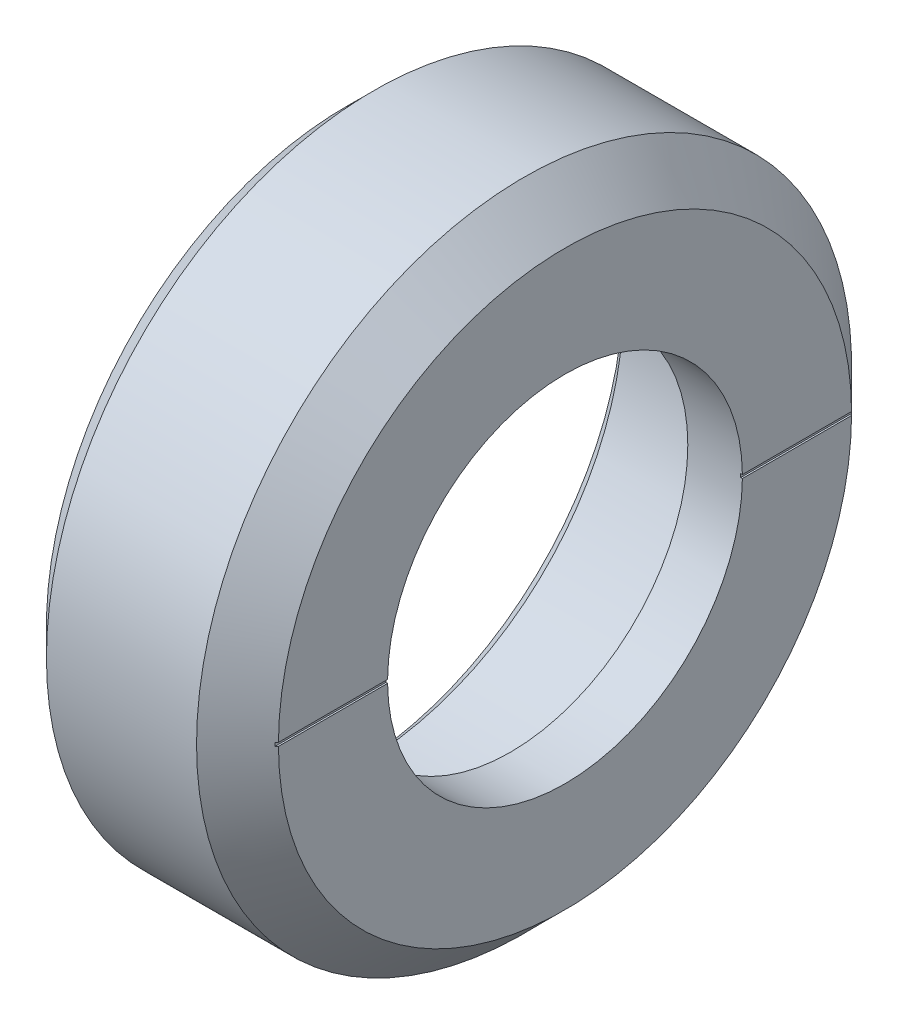
ISO-10303-21;
HEADER;
FILE_DESCRIPTION(('STEP AP214'),'2;1');
FILE_NAME('part.step','',(''),(''),'','','');
FILE_SCHEMA(('AUTOMOTIVE_DESIGN { 1 0 10303 214 1 1 1 1 }'));
ENDSEC;
DATA;
#1=APPLICATION_CONTEXT('core data for automotive mechanical design processes');
#2=APPLICATION_PROTOCOL_DEFINITION('international standard','automotive_design',2000,#1);
#3=PRODUCT_CONTEXT('',#1,'mechanical');
#4=PRODUCT('Part','Part','',(#3));
#5=PRODUCT_RELATED_PRODUCT_CATEGORY('part','',(#4));
#6=PRODUCT_DEFINITION_FORMATION('','',#4);
#7=PRODUCT_DEFINITION_CONTEXT('part definition',#1,'design');
#8=PRODUCT_DEFINITION('design','',#6,#7);
#9=PRODUCT_DEFINITION_SHAPE('','',#8);
#10=(LENGTH_UNIT() NAMED_UNIT(*) SI_UNIT(.MILLI.,.METRE.));
#11=(NAMED_UNIT(*) PLANE_ANGLE_UNIT() SI_UNIT($,.RADIAN.));
#12=(NAMED_UNIT(*) SI_UNIT($,.STERADIAN.) SOLID_ANGLE_UNIT());
#13=UNCERTAINTY_MEASURE_WITH_UNIT(LENGTH_MEASURE(1.E-05),#10,'distance_accuracy_value','');
#14=(GEOMETRIC_REPRESENTATION_CONTEXT(3) GLOBAL_UNCERTAINTY_ASSIGNED_CONTEXT((#13)) GLOBAL_UNIT_ASSIGNED_CONTEXT((#10,
#11,#12)) REPRESENTATION_CONTEXT('',''));
#15=CARTESIAN_POINT('',(0.,0.,0.));
#16=DIRECTION('',(0.,0.,1.));
#17=DIRECTION('',(1.,0.,0.));
#18=AXIS2_PLACEMENT_3D('',#15,#16,#17);
#19=CARTESIAN_POINT('',(16.,24.,0.));
#20=DIRECTION('',(-1.,0.,0.));
#21=DIRECTION('',(0.,0.,1.));
#22=AXIS2_PLACEMENT_3D('',#19,#20,#21);
#23=PLANE('',#22);
#24=DIRECTION('',(0.,0.,1.));
#25=VECTOR('',#24,1.);
#26=CARTESIAN_POINT('',(16.,0.125,0.));
#27=LINE('',#26,#25);
#28=CARTESIAN_POINT('',(16.,0.125,-20.9996279728951));
#29=VERTEX_POINT('',#28);
#30=CARTESIAN_POINT('',(16.,0.125,-12.9993990245703));
#31=VERTEX_POINT('',#30);
#32=EDGE_CURVE('E128',#29,#31,#27,.T.);
#33=ORIENTED_EDGE('',*,*,#32,.F.);
#34=CARTESIAN_POINT('',(16.,0.,0.));
#35=DIRECTION('',(-1.,0.,0.));
#36=DIRECTION('',(0.,0.,1.));
#37=AXIS2_PLACEMENT_3D('',#34,#35,#36);
#38=CIRCLE('',#37,21.);
#39=CARTESIAN_POINT('',(16.,0.125,20.9996279728951));
#40=VERTEX_POINT('',#39);
#41=EDGE_CURVE('E158',#29,#40,#38,.F.);
#42=ORIENTED_EDGE('',*,*,#41,.T.);
#43=CARTESIAN_POINT('',(16.,0.125,12.9993990245703));
#44=VERTEX_POINT('',#43);
#45=EDGE_CURVE('E133',#44,#40,#27,.T.);
#46=ORIENTED_EDGE('',*,*,#45,.F.);
#47=CARTESIAN_POINT('',(16.,0.,0.));
#48=DIRECTION('',(-1.,0.,0.));
#49=DIRECTION('',(0.,0.,1.));
#50=AXIS2_PLACEMENT_3D('',#47,#48,#49);
#51=CIRCLE('',#50,13.);
#52=EDGE_CURVE('E152',#44,#31,#51,.T.);
#53=ORIENTED_EDGE('',*,*,#52,.T.);
#54=EDGE_LOOP('',(#33,#42,#46,#53));
#55=FACE_BOUND('',#54,.T.);
#56=ADVANCED_FACE('F34',(#55),#23,.F.);
#57=DIRECTION('',(0.,0.,-1.));
#58=VECTOR('',#57,1.);
#59=CARTESIAN_POINT('',(16.,-0.125,0.));
#60=LINE('',#59,#58);
#61=CARTESIAN_POINT('',(16.,-0.125,20.9996279728951));
#62=VERTEX_POINT('',#61);
#63=CARTESIAN_POINT('',(16.,-0.125,12.9993990245703));
#64=VERTEX_POINT('',#63);
#65=EDGE_CURVE('E106',#62,#64,#60,.T.);
#66=ORIENTED_EDGE('',*,*,#65,.F.);
#67=CARTESIAN_POINT('',(16.,-0.125,-20.9996279728951));
#68=VERTEX_POINT('',#67);
#69=EDGE_CURVE('E159',#62,#68,#38,.F.);
#70=ORIENTED_EDGE('',*,*,#69,.T.);
#71=CARTESIAN_POINT('',(16.,-0.125,-12.9993990245703));
#72=VERTEX_POINT('',#71);
#73=EDGE_CURVE('E63',#72,#68,#60,.T.);
#74=ORIENTED_EDGE('',*,*,#73,.F.);
#75=EDGE_CURVE('E151',#72,#64,#51,.T.);
#76=ORIENTED_EDGE('',*,*,#75,.T.);
#77=EDGE_LOOP('',(#66,#70,#74,#76));
#78=FACE_BOUND('',#77,.T.);
#79=ADVANCED_FACE('F211',(#78),#23,.F.);
#80=CARTESIAN_POINT('',(0.,0.,0.));
#81=DIRECTION('',(-1.,0.,0.));
#82=DIRECTION('',(0.,0.,1.));
#83=AXIS2_PLACEMENT_3D('',#80,#81,#82);
#84=CYLINDRICAL_SURFACE('',#83,13.);
#85=CARTESIAN_POINT('',(12.,0.,0.));
#86=DIRECTION('',(-1.,0.,0.));
#87=DIRECTION('',(0.,0.,1.));
#88=AXIS2_PLACEMENT_3D('',#85,#86,#87);
#89=CIRCLE('',#88,13.);
#90=CARTESIAN_POINT('',(12.,0.,13.));
#91=VERTEX_POINT('',#90);
#92=EDGE_CURVE('E148',#91,#91,#89,.T.);
#93=ORIENTED_EDGE('',*,*,#92,.T.);
#94=EDGE_LOOP('',(#93));
#95=FACE_BOUND('',#94,.T.);
#96=DIRECTION('',(-1.,0.,0.));
#97=VECTOR('',#96,1.);
#98=CARTESIAN_POINT('',(0.,0.125,-12.9993990245703));
#99=LINE('',#98,#97);
#100=CARTESIAN_POINT('',(15.875,0.125,-12.9993990245703));
#101=VERTEX_POINT('',#100);
#102=EDGE_CURVE('E131',#31,#101,#99,.T.);
#103=ORIENTED_EDGE('',*,*,#102,.F.);
#104=ORIENTED_EDGE('',*,*,#52,.F.);
#105=DIRECTION('',(-1.,0.,0.));
#106=VECTOR('',#105,1.);
#107=CARTESIAN_POINT('',(0.,0.125,12.9993990245703));
#108=LINE('',#107,#106);
#109=CARTESIAN_POINT('',(15.875,0.125,12.9993990245703));
#110=VERTEX_POINT('',#109);
#111=EDGE_CURVE('E127',#110,#44,#108,.F.);
#112=ORIENTED_EDGE('',*,*,#111,.F.);
#113=CARTESIAN_POINT('',(15.875,0.,0.));
#114=DIRECTION('',(1.,0.,0.));
#115=DIRECTION('',(0.,0.,-1.));
#116=AXIS2_PLACEMENT_3D('',#113,#114,#115);
#117=CIRCLE('',#116,13.);
#118=CARTESIAN_POINT('',(15.875,-0.125,12.9993990245703));
#119=VERTEX_POINT('',#118);
#120=EDGE_CURVE('E115',#119,#110,#117,.F.);
#121=ORIENTED_EDGE('',*,*,#120,.F.);
#122=DIRECTION('',(-1.,0.,0.));
#123=VECTOR('',#122,1.);
#124=CARTESIAN_POINT('',(0.,-0.124999999999996,12.9993990245703));
#125=LINE('',#124,#123);
#126=EDGE_CURVE('E103',#64,#119,#125,.T.);
#127=ORIENTED_EDGE('',*,*,#126,.F.);
#128=ORIENTED_EDGE('',*,*,#75,.F.);
#129=DIRECTION('',(-1.,0.,0.));
#130=VECTOR('',#129,1.);
#131=CARTESIAN_POINT('',(0.,-0.124999999999996,-12.9993990245703));
#132=LINE('',#131,#130);
#133=CARTESIAN_POINT('',(15.875,-0.125,-12.9993990245703));
#134=VERTEX_POINT('',#133);
#135=EDGE_CURVE('E134',#134,#72,#132,.F.);
#136=ORIENTED_EDGE('',*,*,#135,.F.);
#137=EDGE_CURVE('E129',#101,#134,#117,.F.);
#138=ORIENTED_EDGE('',*,*,#137,.F.);
#139=EDGE_LOOP('',(#103,#104,#112,#121,#127,#128,#136,#138));
#140=FACE_BOUND('',#139,.T.);
#141=ADVANCED_FACE('F125',(#95,#140),#84,.F.);
#142=CARTESIAN_POINT('',(13.,0.,0.));
#143=DIRECTION('',(-1.,0.,0.));
#144=DIRECTION('',(0.,0.,1.));
#145=AXIS2_PLACEMENT_3D('',#142,#143,#144);
#146=CONICAL_SURFACE('',#145,24.,0.78539816339745);
#147=CARTESIAN_POINT('',(13.,0.,0.));
#148=DIRECTION('',(-1.,0.,0.));
#149=DIRECTION('',(0.,0.,1.));
#150=AXIS2_PLACEMENT_3D('',#147,#148,#149);
#151=CIRCLE('',#150,24.);
#152=CARTESIAN_POINT('',(13.,0.,24.));
#153=VERTEX_POINT('',#152);
#154=EDGE_CURVE('E155',#153,#153,#151,.T.);
#155=ORIENTED_EDGE('',*,*,#154,.F.);
#156=EDGE_LOOP('',(#155));
#157=FACE_BOUND('',#156,.T.);
#158=ORIENTED_EDGE('',*,*,#41,.F.);
#159=CARTESIAN_POINT('',(-12.9252976560844,0.125,49.9251411720451));
#160=CARTESIAN_POINT('',(-9.47868892144603,0.125,46.4785159888659));
#161=CARTESIAN_POINT('',(-6.0320768629025,0.125,43.0318941260126));
#162=CARTESIAN_POINT('',(0.86114243973046,0.125,36.138645580612));
#163=CARTESIAN_POINT('',(4.30774968381989,0.125,32.6920188980649));
#164=CARTESIAN_POINT('',(11.2009590986699,0.125,25.7987380494256));
#165=CARTESIAN_POINT('',(14.6475612693775,0.125,22.3520838832805));
#166=CARTESIAN_POINT('',(21.5407592292771,0.125,15.458769144818));
#167=CARTESIAN_POINT('',(24.9873550184691,0.125,12.0121085725006));
#168=CARTESIAN_POINT('',(29.378847397807,0.125,7.62013753107505));
#169=CARTESIAN_POINT('',(30.323887762627,0.125,6.67497078297029));
#170=CARTESIAN_POINT('',(31.9010751784641,0.125,5.09741305158182));
#171=CARTESIAN_POINT('',(32.5332486021043,0.125,4.46504845219102));
#172=CARTESIAN_POINT('',(33.5882224819469,0.125,3.40951556010458));
#173=CARTESIAN_POINT('',(34.0110626740735,0.125,2.98638695328445));
#174=CARTESIAN_POINT('',(34.7166075968785,0.125,2.28001451117343));
#175=CARTESIAN_POINT('',(34.9993696074962,0.125,1.99682797572084));
#176=CARTESIAN_POINT('',(35.4710250943881,0.125,1.52391912076779));
#177=CARTESIAN_POINT('',(35.6600089052332,0.125,1.3342868108399));
#178=CARTESIAN_POINT('',(35.9750435611063,0.125,1.0174128681121));
#179=CARTESIAN_POINT('',(36.1012198148177,0.125,0.890296376701036));
#180=CARTESIAN_POINT('',(36.2691038312773,0.125,0.720156826097159));
#181=CARTESIAN_POINT('',(36.3111466634024,0.125,0.677464652616413));
#182=CARTESIAN_POINT('',(36.3950680668786,0.125,0.591936908203082));
#183=CARTESIAN_POINT('',(36.4369466719064,0.125,0.549101370411308));
#184=CARTESIAN_POINT('',(36.5065958601945,0.125,0.477356265908579));
#185=CARTESIAN_POINT('',(36.5344501482026,0.125,0.448527963240153));
#186=CARTESIAN_POINT('',(36.5899259938108,0.125,0.390648502551401));
#187=CARTESIAN_POINT('',(36.6175475584739,0.125,0.361597351345891));
#188=CARTESIAN_POINT('',(36.6632939618919,0.125,0.31271820697438));
#189=CARTESIAN_POINT('',(36.6815457618244,0.125,0.293009068425436));
#190=CARTESIAN_POINT('',(36.7176568019819,0.125,0.253303619745465));
#191=CARTESIAN_POINT('',(36.735516771689,0.125,0.233307982810042));
#192=CARTESIAN_POINT('',(36.764563052184,0.125,0.199627211074484));
#193=CARTESIAN_POINT('',(36.7759490342116,0.125,0.18611433816584));
#194=CARTESIAN_POINT('',(36.7982590674934,0.125,0.158557602728288));
#195=CARTESIAN_POINT('',(36.8091797707082,0.125,0.144510939663878));
#196=CARTESIAN_POINT('',(36.8301456772942,0.125,0.115462636734964));
#197=CARTESIAN_POINT('',(36.8401752344993,0.125,0.100449807697324));
#198=CARTESIAN_POINT('',(36.8577745202263,0.125,0.0690623828583643));
#199=CARTESIAN_POINT('',(36.8653729376359,0.125,0.0527067692675883));
#200=CARTESIAN_POINT('',(36.8722910562418,0.125,0.0272919170357236));
#201=CARTESIAN_POINT('',(36.8738624122109,0.125,0.0188987000286322));
#202=CARTESIAN_POINT('',(36.8752665826695,0.125,0.00198824643673188));
#203=CARTESIAN_POINT('',(36.8751057701765,0.125,-0.00652842047201116));
#204=CARTESIAN_POINT('',(36.8731215101269,0.125,-0.0232960091732175));
#205=CARTESIAN_POINT('',(36.8713083550376,0.125,-0.0315482490818322));
#206=CARTESIAN_POINT('',(36.8664308400117,0.125,-0.0477028430076809));
#207=CARTESIAN_POINT('',(36.8633593029656,0.125,-0.0556028969197794));
#208=CARTESIAN_POINT('',(36.8533313284746,0.125,-0.0778265865200559));
#209=CARTESIAN_POINT('',(36.8453389795916,0.125,-0.0916645577396091));
#210=CARTESIAN_POINT('',(36.828048003347,0.125,-0.118516420333479));
#211=CARTESIAN_POINT('',(36.8187435007831,0.125,-0.131526200761651));
#212=CARTESIAN_POINT('',(36.7993638216938,0.125,-0.1571639692317));
#213=CARTESIAN_POINT('',(36.7892818428899,0.125,-0.169786809784387));
#214=CARTESIAN_POINT('',(36.7687529467012,0.125,-0.19467615551624));
#215=CARTESIAN_POINT('',(36.758306944989,0.125,-0.206943430094164));
#216=CARTESIAN_POINT('',(36.7270864735277,0.125,-0.242896234133044));
#217=CARTESIAN_POINT('',(36.7059799166911,0.125,-0.266292412717195));
#218=CARTESIAN_POINT('',(36.6633538104849,0.125,-0.312706678788425));
#219=CARTESIAN_POINT('',(36.6418341909564,0.125,-0.335724700791025));
#220=CARTESIAN_POINT('',(36.5768904209748,0.125,-0.404515871168181));
#221=CARTESIAN_POINT('',(36.5331306078186,0.125,-0.449971877773539));
#222=CARTESIAN_POINT('',(36.4456524942773,0.125,-0.540171619066018));
#223=CARTESIAN_POINT('',(36.4019370164949,0.125,-0.584918122662369));
#224=CARTESIAN_POINT('',(36.3143500958803,0.125,-0.674216016521059));
#225=CARTESIAN_POINT('',(36.2704787391651,0.125,-0.7187674910339));
#226=CARTESIAN_POINT('',(36.1386080897177,0.125,-0.852397541852838));
#227=CARTESIAN_POINT('',(36.0504662841755,0.125,-0.941335167394833));
#228=CARTESIAN_POINT('',(35.8740287356378,0.125,-1.11905822289925));
#229=CARTESIAN_POINT('',(35.7857329919675,0.125,-1.20784365219103));
#230=CARTESIAN_POINT('',(35.5206955409309,0.125,-1.47411687694933));
#231=CARTESIAN_POINT('',(35.3438368027602,0.125,-1.65148814789276));
#232=CARTESIAN_POINT('',(34.989440821709,0.125,-2.00670168785562));
#233=CARTESIAN_POINT('',(34.8119032392578,0.125,-2.18454361775702));
#234=CARTESIAN_POINT('',(34.4567827199271,0.125,-2.54016087596942));
#235=CARTESIAN_POINT('',(34.2791997864107,0.125,-2.71793620763822));
#236=CARTESIAN_POINT('',(33.391905111207,0.125,-3.6060667134762));
#237=CARTESIAN_POINT('',(32.6820054116647,0.125,-4.31623406635029));
#238=CARTESIAN_POINT('',(31.2621288550648,0.125,-5.73652354735152));
#239=CARTESIAN_POINT('',(30.5521519966307,0.125,-6.44664567410196));
#240=CARTESIAN_POINT('',(29.1331392361378,0.125,-7.86587985402368));
#241=CARTESIAN_POINT('',(28.4241033814295,0.125,-8.57499195452887));
#242=CARTESIAN_POINT('',(27.0060235433148,0.125,-9.99319821121912));
#243=CARTESIAN_POINT('',(26.2969795599986,0.125,-10.7022923674944));
#244=CARTESIAN_POINT('',(22.7504204515519,0.125,-14.2490689052053));
#245=CARTESIAN_POINT('',(19.9128549993168,0.125,-17.0867009638875));
#246=CARTESIAN_POINT('',(14.2377022466064,0.125,-22.761957580782));
#247=CARTESIAN_POINT('',(11.4001149460941,0.125,-25.5995821389573));
#248=CARTESIAN_POINT('',(5.72368698758439,0.125,-31.2760664860753));
#249=CARTESIAN_POINT('',(2.88484632560897,0.125,-34.1149262710402));
#250=CARTESIAN_POINT('',(-2.79283656425394,0.125,-39.7926411433705));
#251=CARTESIAN_POINT('',(-5.6316787921397,0.125,-42.6314962307375));
#252=CARTESIAN_POINT('',(-9.21302057997947,0.125,-46.2128515757804));
#253=CARTESIAN_POINT('',(-9.95551915568732,0.125,-46.9553528176758));
#254=CARTESIAN_POINT('',(-11.4404443572832,0.125,-48.4402831127381));
#255=CARTESIAN_POINT('',(-12.1828709831596,0.125,-49.1827121659166));
#256=CARTESIAN_POINT('',(-12.9252976560844,0.125,-49.9251411720451));
#257=B_SPLINE_CURVE_WITH_KNOTS('',3,(#159,#160,#161,#162,#163,#164,#165,#166,#167,#168,#169,
#170,#171,#172,#173,#174,#175,#176,#177,#178,#179,#180,#181,#182,#183,#184,#185,#186,#187,#188,
#189,#190,#191,#192,#193,#194,#195,#196,#197,#198,#199,#200,#201,#202,#203,#204,#205,#206,#207,
#208,#209,#210,#211,#212,#213,#214,#215,#216,#217,#218,#219,#220,#221,#222,#223,#224,#225,#226,
#227,#228,#229,#230,#231,#232,#233,#234,#235,#236,#237,#238,#239,#240,#241,#242,#243,#244,#245,
#246,#247,#248,#249,#250,#251,#252,#253,#254,#255,#256),.UNSPECIFIED.,.F.,.F.,(4,2,2,2,2,2,2,2,
2,2,2,2,2,2,2,2,2,2,2,2,2,2,2,2,2,2,2,2,2,2,2,2,2,2,2,2,2,2,2,2,2,2,2,2,2,2,2,2,4),(0.,
14.6227573478631,29.245514706896,43.8683196204714,58.4911245268065,62.5008593592025,
65.1833495645533,66.977920583549,68.1784787933916,68.9816462967298,69.518963448462,
69.6987187033743,69.8784349367054,69.9986943001206,70.1189500004921,70.199535507854,
70.2799554501239,70.3329628381186,70.386302943322,70.4404456544065,70.4939236242818,
70.5193874888522,70.5447576985253,70.5699709489846,70.5953300492626,70.6430748397891,
70.6910406291907,70.7394882104461,70.7878216592086,70.8823365686628,70.9768676760963,
71.1661496498323,71.3538190085838,71.5413971669988,71.9170427764593,72.2926900369119,
73.0441259460676,73.7980000248384,74.5518288390078,77.5642459676913,80.5767308610171,
83.5850769692085,86.5934022572772,98.6323141889064,110.671256559715,122.715478022308,
134.759692841819,137.909853165087,141.059707724319),.UNSPECIFIED.);
#258=CARTESIAN_POINT('',(15.875,0.125,-21.1246301742776));
#259=VERTEX_POINT('',#258);
#260=EDGE_CURVE('E11',#29,#259,#257,.T.);
#261=ORIENTED_EDGE('',*,*,#260,.T.);
#262=CARTESIAN_POINT('',(15.875,0.,0.));
#263=DIRECTION('',(1.,0.,0.));
#264=DIRECTION('',(0.,0.,-1.));
#265=AXIS2_PLACEMENT_3D('',#262,#263,#264);
#266=CIRCLE('',#265,21.125);
#267=CARTESIAN_POINT('',(15.875,-0.125,-21.1246301742776));
#268=VERTEX_POINT('',#267);
#269=EDGE_CURVE('E48',#259,#268,#266,.F.);
#270=ORIENTED_EDGE('',*,*,#269,.T.);
#271=CARTESIAN_POINT('',(-12.9252976560844,-0.124999999999994,-49.9251411720451));
#272=CARTESIAN_POINT('',(-9.47868892144603,-0.124999999999995,-46.4785159888659));
#273=CARTESIAN_POINT('',(-6.0320768629025,-0.124999999999995,-43.0318941260125));
#274=CARTESIAN_POINT('',(0.861142439730467,-0.124999999999997,-36.138645580612));
#275=CARTESIAN_POINT('',(4.3077496838199,-0.124999999999997,-32.6920188980649));
#276=CARTESIAN_POINT('',(11.2009590986699,-0.124999999999999,-25.7987380494256));
#277=CARTESIAN_POINT('',(14.6475612693775,-0.124999999999999,-22.3520838832805));
#278=CARTESIAN_POINT('',(21.5407592292771,-0.125000000000001,-15.458769144818));
#279=CARTESIAN_POINT('',(24.9873550184691,-0.125000000000002,-12.0121085725006));
#280=CARTESIAN_POINT('',(29.378847397807,-0.125000000000002,-7.62013753107506));
#281=CARTESIAN_POINT('',(30.323887762627,-0.125000000000003,-6.67497078297029));
#282=CARTESIAN_POINT('',(31.9010751784641,-0.125000000000003,-5.09741305158182));
#283=CARTESIAN_POINT('',(32.5332486021043,-0.125000000000003,-4.46504845219102));
#284=CARTESIAN_POINT('',(33.5882224819469,-0.125000000000003,-3.40951556010459));
#285=CARTESIAN_POINT('',(34.0110626740735,-0.125000000000003,-2.98638695328446));
#286=CARTESIAN_POINT('',(34.7166075968785,-0.125000000000004,-2.28001451117344));
#287=CARTESIAN_POINT('',(34.9993696074962,-0.125000000000004,-1.99682797572085));
#288=CARTESIAN_POINT('',(35.4710250943881,-0.125000000000004,-1.52391912076779));
#289=CARTESIAN_POINT('',(35.6600089052332,-0.125000000000004,-1.33428681083991));
#290=CARTESIAN_POINT('',(35.9750435611063,-0.125000000000004,-1.0174128681121));
#291=CARTESIAN_POINT('',(36.1012198148177,-0.125000000000004,-0.890296376701036));
#292=CARTESIAN_POINT('',(36.2691038312773,-0.125000000000004,-0.720156826097158));
#293=CARTESIAN_POINT('',(36.3111466634024,-0.125000000000004,-0.677464652616412));
#294=CARTESIAN_POINT('',(36.3950680668786,-0.125000000000004,-0.591936908203081));
#295=CARTESIAN_POINT('',(36.4369466719064,-0.125000000000004,-0.549101370411308));
#296=CARTESIAN_POINT('',(36.5065958601945,-0.125000000000004,-0.477356265908578));
#297=CARTESIAN_POINT('',(36.5344501482026,-0.125000000000004,-0.448527963240152));
#298=CARTESIAN_POINT('',(36.5899259938108,-0.125000000000004,-0.390648502551399));
#299=CARTESIAN_POINT('',(36.6175475584739,-0.125000000000004,-0.361597351345889));
#300=CARTESIAN_POINT('',(36.6632939618919,-0.125000000000004,-0.312718206974379));
#301=CARTESIAN_POINT('',(36.6815457618244,-0.125000000000004,-0.293009068425434));
#302=CARTESIAN_POINT('',(36.7176568019819,-0.125000000000004,-0.253303619745461));
#303=CARTESIAN_POINT('',(36.735516771689,-0.125000000000004,-0.233307982810037));
#304=CARTESIAN_POINT('',(36.764563052184,-0.125000000000004,-0.199627211074481));
#305=CARTESIAN_POINT('',(36.7759490342116,-0.125000000000004,-0.186114338165837));
#306=CARTESIAN_POINT('',(36.7982590674934,-0.125000000000004,-0.158557602728282));
#307=CARTESIAN_POINT('',(36.8091797707082,-0.125000000000004,-0.144510939663869));
#308=CARTESIAN_POINT('',(36.8301456772942,-0.125000000000004,-0.115462636734952));
#309=CARTESIAN_POINT('',(36.8401752344993,-0.125000000000004,-0.100449807697314));
#310=CARTESIAN_POINT('',(36.8577745202263,-0.125000000000004,-0.0690623828583508));
#311=CARTESIAN_POINT('',(36.8653729376359,-0.125000000000004,-0.0527067692675704));
#312=CARTESIAN_POINT('',(36.8722910562418,-0.125000000000004,-0.0272919170357001));
#313=CARTESIAN_POINT('',(36.873862412211,-0.125000000000004,-0.018898700028608));
#314=CARTESIAN_POINT('',(36.8752665826695,-0.125000000000004,-0.00198824643670701));
#315=CARTESIAN_POINT('',(36.8751057701765,-0.125000000000004,0.00652842047203608));
#316=CARTESIAN_POINT('',(36.8731215101269,-0.125000000000004,0.0232960091732427));
#317=CARTESIAN_POINT('',(36.8713083550376,-0.125000000000004,0.0315482490818577));
#318=CARTESIAN_POINT('',(36.8664308400117,-0.125000000000004,0.0477028430077052));
#319=CARTESIAN_POINT('',(36.8633593029656,-0.125000000000004,0.0556028969198021));
#320=CARTESIAN_POINT('',(36.8533313284746,-0.125000000000004,0.0778265865200856));
#321=CARTESIAN_POINT('',(36.8453389795915,-0.125000000000004,0.091664557739648));
#322=CARTESIAN_POINT('',(36.8280480033469,-0.125000000000004,0.118516420333533));
#323=CARTESIAN_POINT('',(36.818743500783,-0.125000000000004,0.131526200761711));
#324=CARTESIAN_POINT('',(36.7993638216938,-0.125000000000004,0.157163969231774));
#325=CARTESIAN_POINT('',(36.7892818428898,-0.125000000000004,0.169786809784468));
#326=CARTESIAN_POINT('',(36.7687529467011,-0.125000000000004,0.194676155516336));
#327=CARTESIAN_POINT('',(36.7583069449889,-0.125000000000004,0.206943430094268));
#328=CARTESIAN_POINT('',(36.7270864735276,-0.125000000000004,0.242896234133168));
#329=CARTESIAN_POINT('',(36.705979916691,-0.125000000000004,0.266292412717329));
#330=CARTESIAN_POINT('',(36.6633538104848,-0.125000000000004,0.31270667878858));
#331=CARTESIAN_POINT('',(36.6418341909562,-0.125000000000004,0.335724700791189));
#332=CARTESIAN_POINT('',(36.5768904209746,-0.125000000000004,0.404515871168388));
#333=CARTESIAN_POINT('',(36.5331306078184,-0.125000000000004,0.449971877773779));
#334=CARTESIAN_POINT('',(36.445652494277,-0.125000000000004,0.540171619066319));
#335=CARTESIAN_POINT('',(36.4019370164946,-0.125000000000004,0.584918122662698));
#336=CARTESIAN_POINT('',(36.3143500958799,-0.125000000000004,0.674216016521441));
#337=CARTESIAN_POINT('',(36.2704787391647,-0.125000000000004,0.718767491034309));
#338=CARTESIAN_POINT('',(36.1386080897173,-0.125000000000004,0.852397541853324));
#339=CARTESIAN_POINT('',(36.050466284175,-0.125000000000004,0.941335167395367));
#340=CARTESIAN_POINT('',(35.8740287356372,-0.125000000000004,1.11905822289989));
#341=CARTESIAN_POINT('',(35.7857329919669,-0.125000000000004,1.20784365219174));
#342=CARTESIAN_POINT('',(35.52069554093,-0.125000000000004,1.47411687695021));
#343=CARTESIAN_POINT('',(35.3438368027592,-0.125000000000004,1.65148814789374));
#344=CARTESIAN_POINT('',(34.9894408217078,-0.125000000000004,2.00670168785682));
#345=CARTESIAN_POINT('',(34.8119032392565,-0.125000000000004,2.18454361775833));
#346=CARTESIAN_POINT('',(34.4567827199255,-0.125000000000003,2.54016087597096));
#347=CARTESIAN_POINT('',(34.2791997864091,-0.125000000000003,2.71793620763986));
#348=CARTESIAN_POINT('',(33.3919051112048,-0.125000000000003,3.6060667134784));
#349=CARTESIAN_POINT('',(32.6820054116621,-0.125000000000003,4.31623406635293));
#350=CARTESIAN_POINT('',(31.2621288550612,-0.125000000000003,5.73652354735504));
#351=CARTESIAN_POINT('',(30.5521519966267,-0.125000000000003,6.44664567410593));
#352=CARTESIAN_POINT('',(29.133139236133,-0.125000000000002,7.86587985402854));
#353=CARTESIAN_POINT('',(28.4241033814242,-0.125000000000002,8.57499195453416));
#354=CARTESIAN_POINT('',(27.0060235433086,-0.125000000000002,9.9931982112253));
#355=CARTESIAN_POINT('',(26.2969795599919,-0.125000000000002,10.702292367501));
#356=CARTESIAN_POINT('',(22.7504204515431,-0.125000000000001,14.2490689052142));
#357=CARTESIAN_POINT('',(19.9128549993062,-0.125,17.0867009638981));
#358=CARTESIAN_POINT('',(14.2377022465922,-0.124999999999999,22.7619575807962));
#359=CARTESIAN_POINT('',(11.4001149460782,-0.124999999999999,25.5995821389732));
#360=CARTESIAN_POINT('',(5.72368698756493,-0.124999999999998,31.2760664860947));
#361=CARTESIAN_POINT('',(2.88484632558774,-0.124999999999997,34.1149262710615));
#362=CARTESIAN_POINT('',(-2.79283656427871,-0.124999999999996,39.7926411433953));
#363=CARTESIAN_POINT('',(-5.63167879216625,-0.124999999999995,42.6314962307641));
#364=CARTESIAN_POINT('',(-9.21302058000306,-0.124999999999995,46.212851575804));
#365=CARTESIAN_POINT('',(-9.95551915570619,-0.124999999999994,46.9553528176947));
#366=CARTESIAN_POINT('',(-11.4404443572926,-0.124999999999994,48.4402831127475));
#367=CARTESIAN_POINT('',(-12.1828709831644,-0.124999999999994,49.1827121659213));
#368=CARTESIAN_POINT('',(-12.9252976560844,-0.124999999999994,49.9251411720451));
#369=B_SPLINE_CURVE_WITH_KNOTS('',3,(#271,#272,#273,#274,#275,#276,#277,#278,#279,#280,#281,
#282,#283,#284,#285,#286,#287,#288,#289,#290,#291,#292,#293,#294,#295,#296,#297,#298,#299,#300,
#301,#302,#303,#304,#305,#306,#307,#308,#309,#310,#311,#312,#313,#314,#315,#316,#317,#318,#319,
#320,#321,#322,#323,#324,#325,#326,#327,#328,#329,#330,#331,#332,#333,#334,#335,#336,#337,#338,
#339,#340,#341,#342,#343,#344,#345,#346,#347,#348,#349,#350,#351,#352,#353,#354,#355,#356,#357,
#358,#359,#360,#361,#362,#363,#364,#365,#366,#367,#368),.UNSPECIFIED.,.F.,.F.,(4,2,2,2,2,2,2,2,
2,2,2,2,2,2,2,2,2,2,2,2,2,2,2,2,2,2,2,2,2,2,2,2,2,2,2,2,2,2,2,2,2,2,2,2,2,2,2,2,4),(0.,
14.6227573478632,29.2455147068961,43.8683196204714,58.4911245268065,62.5008593592025,
65.1833495645533,66.977920583549,68.1784787933916,68.9816462967298,69.518963448462,
69.6987187033743,69.8784349367054,69.9986943001207,70.1189500004922,70.199535507854,
70.2799554501239,70.3329628381186,70.386302943322,70.4404456544065,70.4939236242818,
70.5193874888523,70.5447576985253,70.5699709489846,70.5953300492626,70.6430748397891,
70.6910406291907,70.7394882104462,70.7878216592087,70.882336568663,70.9768676760966,
71.1661496498326,71.3538190085843,71.5413971669994,71.9170427764601,72.292690036913,
73.0441259460691,73.7980000248404,74.5518288390103,77.5642459676957,80.5767308610234,
83.5850769692166,86.5934022572872,98.6323141889239,110.67125655974,122.715478022341,
134.759692841859,137.909853165107,141.059707724319),.UNSPECIFIED.);
#370=EDGE_CURVE('E179',#268,#68,#369,.T.);
#371=ORIENTED_EDGE('',*,*,#370,.T.);
#372=ORIENTED_EDGE('',*,*,#69,.F.);
#373=CARTESIAN_POINT('',(15.875,-0.125,21.1246301742776));
#374=VERTEX_POINT('',#373);
#375=EDGE_CURVE('E174',#62,#374,#369,.T.);
#376=ORIENTED_EDGE('',*,*,#375,.T.);
#377=CARTESIAN_POINT('',(15.875,0.125,21.1246301742776));
#378=VERTEX_POINT('',#377);
#379=EDGE_CURVE('E118',#374,#378,#266,.F.);
#380=ORIENTED_EDGE('',*,*,#379,.T.);
#381=EDGE_CURVE('E38',#378,#40,#257,.T.);
#382=ORIENTED_EDGE('',*,*,#381,.T.);
#383=EDGE_LOOP('',(#158,#261,#270,#371,#372,#376,#380,#382));
#384=FACE_BOUND('',#383,.T.);
#385=ADVANCED_FACE('F180',(#157,#384),#146,.T.);
#386=CARTESIAN_POINT('',(0.,0.,0.));
#387=DIRECTION('',(-1.,0.,0.));
#388=DIRECTION('',(0.,0.,1.));
#389=AXIS2_PLACEMENT_3D('',#386,#387,#388);
#390=CYLINDRICAL_SURFACE('',#389,19.25);
#391=CARTESIAN_POINT('',(1.,0.,0.));
#392=DIRECTION('',(1.,0.,0.));
#393=DIRECTION('',(0.,0.,-1.));
#394=AXIS2_PLACEMENT_3D('',#391,#392,#393);
#395=CIRCLE('',#394,19.25);
#396=CARTESIAN_POINT('',(1.,0.,-19.25));
#397=VERTEX_POINT('',#396);
#398=EDGE_CURVE('E168',#397,#397,#395,.F.);
#399=ORIENTED_EDGE('',*,*,#398,.T.);
#400=EDGE_LOOP('',(#399));
#401=FACE_BOUND('',#400,.T.);
#402=CARTESIAN_POINT('',(11.,0.,0.));
#403=DIRECTION('',(-1.,0.,0.));
#404=DIRECTION('',(0.,0.,1.));
#405=AXIS2_PLACEMENT_3D('',#402,#403,#404);
#406=CIRCLE('',#405,19.25);
#407=CARTESIAN_POINT('',(11.,0.,19.25));
#408=VERTEX_POINT('',#407);
#409=EDGE_CURVE('E139',#408,#408,#406,.T.);
#410=ORIENTED_EDGE('',*,*,#409,.F.);
#411=EDGE_LOOP('',(#410));
#412=FACE_BOUND('',#411,.T.);
#413=ADVANCED_FACE('F36',(#401,#412),#390,.F.);
#414=CARTESIAN_POINT('',(0.,19.25,0.));
#415=DIRECTION('',(1.,0.,0.));
#416=DIRECTION('',(0.,0.,-1.));
#417=AXIS2_PLACEMENT_3D('',#414,#415,#416);
#418=PLANE('',#417);
#419=CARTESIAN_POINT('',(0.,0.,0.));
#420=DIRECTION('',(1.,0.,0.));
#421=DIRECTION('',(0.,0.,-1.));
#422=AXIS2_PLACEMENT_3D('',#419,#420,#421);
#423=CIRCLE('',#422,20.25);
#424=CARTESIAN_POINT('',(0.,0.,-20.25));
#425=VERTEX_POINT('',#424);
#426=EDGE_CURVE('E171',#425,#425,#423,.T.);
#427=ORIENTED_EDGE('',*,*,#426,.T.);
#428=EDGE_LOOP('',(#427));
#429=FACE_BOUND('',#428,.T.);
#430=CARTESIAN_POINT('',(0.,0.,0.));
#431=DIRECTION('',(1.,0.,0.));
#432=DIRECTION('',(0.,0.,-1.));
#433=AXIS2_PLACEMENT_3D('',#430,#431,#432);
#434=CIRCLE('',#433,22.);
#435=CARTESIAN_POINT('',(0.,0.,-22.));
#436=VERTEX_POINT('',#435);
#437=EDGE_CURVE('E162',#436,#436,#434,.F.);
#438=ORIENTED_EDGE('',*,*,#437,.T.);
#439=EDGE_LOOP('',(#438));
#440=FACE_BOUND('',#439,.T.);
#441=ADVANCED_FACE('F225',(#429,#440),#418,.F.);
#442=CARTESIAN_POINT('',(0.,0.,0.));
#443=DIRECTION('',(-1.,0.,0.));
#444=DIRECTION('',(0.,0.,1.));
#445=AXIS2_PLACEMENT_3D('',#442,#443,#444);
#446=CYLINDRICAL_SURFACE('',#445,24.);
#447=CARTESIAN_POINT('',(2.00000000000001,0.,0.));
#448=DIRECTION('',(1.,0.,0.));
#449=DIRECTION('',(0.,0.,-1.));
#450=AXIS2_PLACEMENT_3D('',#447,#448,#449);
#451=CIRCLE('',#450,24.);
#452=CARTESIAN_POINT('',(2.00000000000001,0.,-24.));
#453=VERTEX_POINT('',#452);
#454=EDGE_CURVE('E165',#453,#453,#451,.T.);
#455=ORIENTED_EDGE('',*,*,#454,.T.);
#456=EDGE_LOOP('',(#455));
#457=FACE_BOUND('',#456,.T.);
#458=ORIENTED_EDGE('',*,*,#154,.T.);
#459=EDGE_LOOP('',(#458));
#460=FACE_BOUND('',#459,.T.);
#461=ADVANCED_FACE('F222',(#457,#460),#446,.T.);
#462=CARTESIAN_POINT('',(12.,13.,0.));
#463=DIRECTION('',(1.,0.,0.));
#464=DIRECTION('',(0.,0.,-1.));
#465=AXIS2_PLACEMENT_3D('',#462,#463,#464);
#466=PLANE('',#465);
#467=ORIENTED_EDGE('',*,*,#92,.F.);
#468=EDGE_LOOP('',(#467));
#469=FACE_BOUND('',#468,.T.);
#470=CARTESIAN_POINT('',(12.,0.,0.));
#471=DIRECTION('',(-1.,0.,0.));
#472=DIRECTION('',(0.,0.,1.));
#473=AXIS2_PLACEMENT_3D('',#470,#471,#472);
#474=CIRCLE('',#473,20.25);
#475=CARTESIAN_POINT('',(12.,0.,20.25));
#476=VERTEX_POINT('',#475);
#477=EDGE_CURVE('E145',#476,#476,#474,.T.);
#478=ORIENTED_EDGE('',*,*,#477,.T.);
#479=EDGE_LOOP('',(#478));
#480=FACE_BOUND('',#479,.T.);
#481=ADVANCED_FACE('F224',(#469,#480),#466,.F.);
#482=CARTESIAN_POINT('',(0.,0.,0.));
#483=DIRECTION('',(-1.,0.,0.));
#484=DIRECTION('',(0.,0.,1.));
#485=AXIS2_PLACEMENT_3D('',#482,#483,#484);
#486=CYLINDRICAL_SURFACE('',#485,20.25);
#487=ORIENTED_EDGE('',*,*,#477,.F.);
#488=EDGE_LOOP('',(#487));
#489=FACE_BOUND('',#488,.T.);
#490=CARTESIAN_POINT('',(11.,0.,0.));
#491=DIRECTION('',(-1.,0.,0.));
#492=DIRECTION('',(0.,0.,1.));
#493=AXIS2_PLACEMENT_3D('',#490,#491,#492);
#494=CIRCLE('',#493,20.25);
#495=CARTESIAN_POINT('',(11.,0.,20.25));
#496=VERTEX_POINT('',#495);
#497=EDGE_CURVE('E142',#496,#496,#494,.T.);
#498=ORIENTED_EDGE('',*,*,#497,.T.);
#499=EDGE_LOOP('',(#498));
#500=FACE_BOUND('',#499,.T.);
#501=ADVANCED_FACE('F206',(#489,#500),#486,.F.);
#502=CARTESIAN_POINT('',(11.,20.25,0.));
#503=DIRECTION('',(-1.,0.,0.));
#504=DIRECTION('',(0.,0.,1.));
#505=AXIS2_PLACEMENT_3D('',#502,#503,#504);
#506=PLANE('',#505);
#507=ORIENTED_EDGE('',*,*,#497,.F.);
#508=EDGE_LOOP('',(#507));
#509=FACE_BOUND('',#508,.T.);
#510=ORIENTED_EDGE('',*,*,#409,.T.);
#511=EDGE_LOOP('',(#510));
#512=FACE_BOUND('',#511,.T.);
#513=ADVANCED_FACE('F201',(#509,#512),#506,.F.);
#514=CARTESIAN_POINT('',(0.,0.,0.));
#515=DIRECTION('',(1.,0.,0.));
#516=DIRECTION('',(0.,0.,-1.));
#517=AXIS2_PLACEMENT_3D('',#514,#515,#516);
#518=CONICAL_SURFACE('',#517,22.,0.785398163397448);
#519=ORIENTED_EDGE('',*,*,#454,.F.);
#520=EDGE_LOOP('',(#519));
#521=FACE_BOUND('',#520,.T.);
#522=ORIENTED_EDGE('',*,*,#437,.F.);
#523=EDGE_LOOP('',(#522));
#524=FACE_BOUND('',#523,.T.);
#525=ADVANCED_FACE('F198',(#521,#524),#518,.T.);
#526=CARTESIAN_POINT('',(1.,0.,0.));
#527=DIRECTION('',(-1.,0.,0.));
#528=DIRECTION('',(0.,0.,1.));
#529=AXIS2_PLACEMENT_3D('',#526,#527,#528);
#530=CONICAL_SURFACE('',#529,19.25,0.78539816339745);
#531=ORIENTED_EDGE('',*,*,#426,.F.);
#532=EDGE_LOOP('',(#531));
#533=FACE_BOUND('',#532,.T.);
#534=ORIENTED_EDGE('',*,*,#398,.F.);
#535=EDGE_LOOP('',(#534));
#536=FACE_BOUND('',#535,.T.);
#537=ADVANCED_FACE('F196',(#533,#536),#530,.F.);
#538=CARTESIAN_POINT('',(18.,-0.125,41.5));
#539=DIRECTION('',(0.,1.,0.));
#540=DIRECTION('',(-1.,0.,0.));
#541=AXIS2_PLACEMENT_3D('',#538,#539,#540);
#542=PLANE('',#541);
#543=ORIENTED_EDGE('',*,*,#126,.T.);
#544=DIRECTION('',(0.,0.,-1.));
#545=VECTOR('',#544,1.);
#546=CARTESIAN_POINT('',(15.875,-0.125,41.5));
#547=LINE('',#546,#545);
#548=EDGE_CURVE('E55',#374,#119,#547,.T.);
#549=ORIENTED_EDGE('',*,*,#548,.F.);
#550=ORIENTED_EDGE('',*,*,#375,.F.);
#551=ORIENTED_EDGE('',*,*,#65,.T.);
#552=EDGE_LOOP('',(#543,#549,#550,#551));
#553=FACE_BOUND('',#552,.T.);
#554=ADVANCED_FACE('F104',(#553),#542,.T.);
#555=CARTESIAN_POINT('',(15.875,0.125,41.5));
#556=DIRECTION('',(1.,0.,0.));
#557=DIRECTION('',(0.,0.,-1.));
#558=AXIS2_PLACEMENT_3D('',#555,#556,#557);
#559=PLANE('',#558);
#560=ORIENTED_EDGE('',*,*,#120,.T.);
#561=DIRECTION('',(0.,0.,-1.));
#562=VECTOR('',#561,1.);
#563=CARTESIAN_POINT('',(15.875,0.125,41.5));
#564=LINE('',#563,#562);
#565=EDGE_CURVE('E266',#378,#110,#564,.T.);
#566=ORIENTED_EDGE('',*,*,#565,.F.);
#567=ORIENTED_EDGE('',*,*,#379,.F.);
#568=ORIENTED_EDGE('',*,*,#548,.T.);
#569=EDGE_LOOP('',(#560,#566,#567,#568));
#570=FACE_BOUND('',#569,.T.);
#571=ADVANCED_FACE('F113',(#570),#559,.T.);
#572=CARTESIAN_POINT('',(18.,0.125,41.5));
#573=DIRECTION('',(0.,-1.,0.));
#574=DIRECTION('',(0.,0.,-1.));
#575=AXIS2_PLACEMENT_3D('',#572,#573,#574);
#576=PLANE('',#575);
#577=ORIENTED_EDGE('',*,*,#111,.T.);
#578=ORIENTED_EDGE('',*,*,#45,.T.);
#579=ORIENTED_EDGE('',*,*,#381,.F.);
#580=ORIENTED_EDGE('',*,*,#565,.T.);
#581=EDGE_LOOP('',(#577,#578,#579,#580));
#582=FACE_BOUND('',#581,.T.);
#583=ADVANCED_FACE('F190',(#582),#576,.T.);
#584=ORIENTED_EDGE('',*,*,#102,.T.);
#585=EDGE_CURVE('E120',#101,#259,#564,.T.);
#586=ORIENTED_EDGE('',*,*,#585,.T.);
#587=ORIENTED_EDGE('',*,*,#260,.F.);
#588=ORIENTED_EDGE('',*,*,#32,.T.);
#589=EDGE_LOOP('',(#584,#586,#587,#588));
#590=FACE_BOUND('',#589,.T.);
#591=ADVANCED_FACE('F194',(#590),#576,.T.);
#592=ORIENTED_EDGE('',*,*,#137,.T.);
#593=EDGE_CURVE('E121',#134,#268,#547,.T.);
#594=ORIENTED_EDGE('',*,*,#593,.T.);
#595=ORIENTED_EDGE('',*,*,#269,.F.);
#596=ORIENTED_EDGE('',*,*,#585,.F.);
#597=EDGE_LOOP('',(#592,#594,#595,#596));
#598=FACE_BOUND('',#597,.T.);
#599=ADVANCED_FACE('F188',(#598),#559,.T.);
#600=ORIENTED_EDGE('',*,*,#135,.T.);
#601=ORIENTED_EDGE('',*,*,#73,.T.);
#602=ORIENTED_EDGE('',*,*,#370,.F.);
#603=ORIENTED_EDGE('',*,*,#593,.F.);
#604=EDGE_LOOP('',(#600,#601,#602,#603));
#605=FACE_BOUND('',#604,.T.);
#606=ADVANCED_FACE('F184',(#605),#542,.T.);
#607=CLOSED_SHELL('',(#56,#79,#141,#385,#413,#441,#461,#481,#501,#513,#525,#537,#554,#571,#583,
#591,#599,#606));
#608=MANIFOLD_SOLID_BREP('B2',#607);
#609=ADVANCED_BREP_SHAPE_REPRESENTATION('',(#18,#608),#14);
#610=SHAPE_DEFINITION_REPRESENTATION(#9,#609);
ENDSEC;
END-ISO-10303-21;
